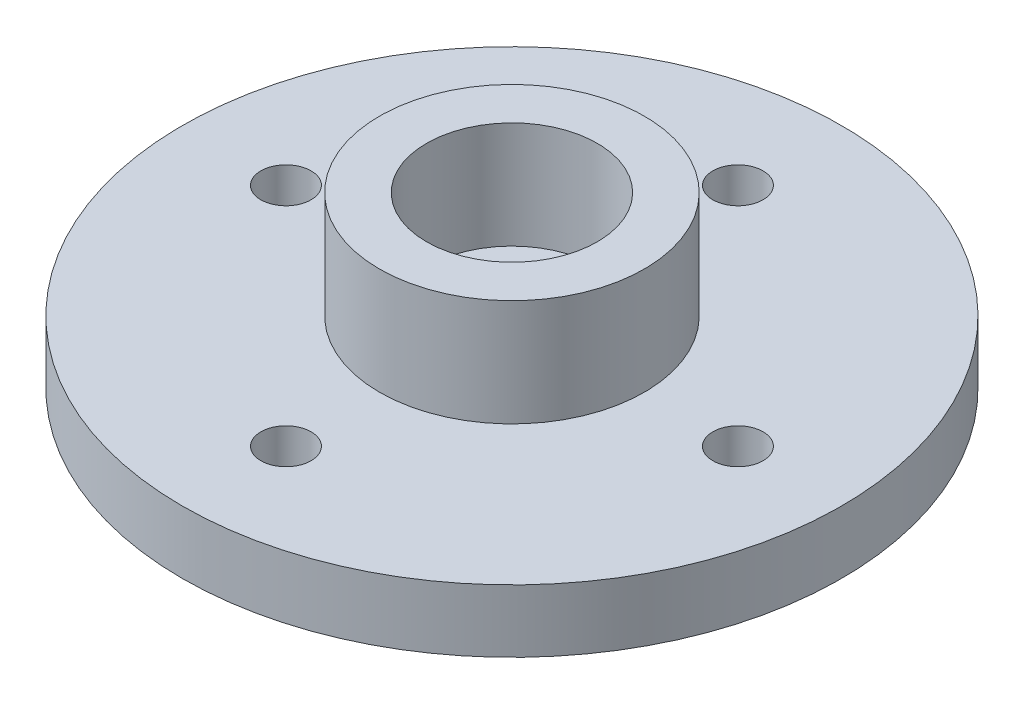
ISO-10303-21;
HEADER;
FILE_DESCRIPTION(('STEP AP214'),'2;1');
FILE_NAME('part.step','',(''),(''),'','','');
FILE_SCHEMA(('AUTOMOTIVE_DESIGN { 1 0 10303 214 1 1 1 1 }'));
ENDSEC;
DATA;
#1=APPLICATION_CONTEXT('core data for automotive mechanical design processes');
#2=APPLICATION_PROTOCOL_DEFINITION('international standard','automotive_design',2000,#1);
#3=PRODUCT_CONTEXT('',#1,'mechanical');
#4=PRODUCT('Part','Part','',(#3));
#5=PRODUCT_RELATED_PRODUCT_CATEGORY('part','',(#4));
#6=PRODUCT_DEFINITION_FORMATION('','',#4);
#7=PRODUCT_DEFINITION_CONTEXT('part definition',#1,'design');
#8=PRODUCT_DEFINITION('design','',#6,#7);
#9=PRODUCT_DEFINITION_SHAPE('','',#8);
#10=(LENGTH_UNIT() NAMED_UNIT(*) SI_UNIT(.MILLI.,.METRE.));
#11=(NAMED_UNIT(*) PLANE_ANGLE_UNIT() SI_UNIT($,.RADIAN.));
#12=(NAMED_UNIT(*) SI_UNIT($,.STERADIAN.) SOLID_ANGLE_UNIT());
#13=UNCERTAINTY_MEASURE_WITH_UNIT(LENGTH_MEASURE(1.E-05),#10,'distance_accuracy_value','');
#14=(GEOMETRIC_REPRESENTATION_CONTEXT(3) GLOBAL_UNCERTAINTY_ASSIGNED_CONTEXT((#13)) GLOBAL_UNIT_ASSIGNED_CONTEXT((#10,
#11,#12)) REPRESENTATION_CONTEXT('',''));
#15=CARTESIAN_POINT('',(0.,0.,0.));
#16=DIRECTION('',(0.,0.,1.));
#17=DIRECTION('',(1.,0.,0.));
#18=AXIS2_PLACEMENT_3D('',#15,#16,#17);
#19=CARTESIAN_POINT('',(0.,2.,0.));
#20=DIRECTION('',(0.,1.,0.));
#21=DIRECTION('',(0.,0.,1.));
#22=AXIS2_PLACEMENT_3D('',#19,#20,#21);
#23=PLANE('',#22);
#24=CARTESIAN_POINT('',(0.,2.,0.));
#25=DIRECTION('',(0.,1.,0.));
#26=DIRECTION('',(0.,0.,1.));
#27=AXIS2_PLACEMENT_3D('',#24,#25,#26);
#28=CIRCLE('',#27,1.5);
#29=CARTESIAN_POINT('',(0.,2.,1.5));
#30=VERTEX_POINT('',#29);
#31=EDGE_CURVE('E80',#30,#30,#28,.T.);
#32=ORIENTED_EDGE('',*,*,#31,.F.);
#33=EDGE_LOOP('',(#32));
#34=FACE_BOUND('',#33,.T.);
#35=CARTESIAN_POINT('',(0.,2.,0.));
#36=DIRECTION('',(0.,1.,0.));
#37=DIRECTION('',(0.,0.,1.));
#38=AXIS2_PLACEMENT_3D('',#35,#36,#37);
#39=CIRCLE('',#38,2.72);
#40=CARTESIAN_POINT('',(0.,2.,2.72));
#41=VERTEX_POINT('',#40);
#42=EDGE_CURVE('E10',#41,#41,#39,.F.);
#43=ORIENTED_EDGE('',*,*,#42,.F.);
#44=EDGE_LOOP('',(#43));
#45=FACE_BOUND('',#44,.T.);
#46=ADVANCED_FACE('F38',(#34,#45),#23,.T.);
#47=CARTESIAN_POINT('',(0.,2.,0.));
#48=DIRECTION('',(0.,1.,0.));
#49=DIRECTION('',(0.,0.,1.));
#50=AXIS2_PLACEMENT_3D('',#47,#48,#49);
#51=CIRCLE('',#50,4.22);
#52=CARTESIAN_POINT('',(0.,2.,4.22));
#53=VERTEX_POINT('',#52);
#54=EDGE_CURVE('E86',#53,#53,#51,.T.);
#55=ORIENTED_EDGE('',*,*,#54,.F.);
#56=EDGE_LOOP('',(#55));
#57=FACE_BOUND('',#56,.T.);
#58=CARTESIAN_POINT('',(4.06627378711659E-13,2.,7.2));
#59=DIRECTION('',(0.,1.,0.));
#60=DIRECTION('',(0.,0.,1.));
#61=AXIS2_PLACEMENT_3D('',#58,#59,#60);
#62=CIRCLE('',#61,0.800000000000437);
#63=CARTESIAN_POINT('',(4.06627378711659E-13,2.,8.00000000000044));
#64=VERTEX_POINT('',#63);
#65=EDGE_CURVE('E65',#64,#64,#62,.T.);
#66=ORIENTED_EDGE('',*,*,#65,.F.);
#67=EDGE_LOOP('',(#66));
#68=FACE_BOUND('',#67,.T.);
#69=CARTESIAN_POINT('',(0.,2.,-7.2));
#70=DIRECTION('',(0.,1.,0.));
#71=DIRECTION('',(0.,0.,1.));
#72=AXIS2_PLACEMENT_3D('',#69,#70,#71);
#73=CIRCLE('',#72,0.8);
#74=CARTESIAN_POINT('',(0.,2.,-6.4));
#75=VERTEX_POINT('',#74);
#76=EDGE_CURVE('E54',#75,#75,#73,.T.);
#77=ORIENTED_EDGE('',*,*,#76,.F.);
#78=EDGE_LOOP('',(#77));
#79=FACE_BOUND('',#78,.T.);
#80=CARTESIAN_POINT('',(0.,2.,0.));
#81=DIRECTION('',(0.,1.,0.));
#82=DIRECTION('',(0.,0.,1.));
#83=AXIS2_PLACEMENT_3D('',#80,#81,#82);
#84=CIRCLE('',#83,10.5);
#85=CARTESIAN_POINT('',(0.,2.,10.5));
#86=VERTEX_POINT('',#85);
#87=EDGE_CURVE('E45',#86,#86,#84,.T.);
#88=ORIENTED_EDGE('',*,*,#87,.T.);
#89=EDGE_LOOP('',(#88));
#90=FACE_BOUND('',#89,.T.);
#91=CARTESIAN_POINT('',(7.2000000000002,2.,-2.0331368935583E-13));
#92=DIRECTION('',(0.,1.,0.));
#93=DIRECTION('',(0.,0.,1.));
#94=AXIS2_PLACEMENT_3D('',#91,#92,#93);
#95=CIRCLE('',#94,0.800000000000159);
#96=CARTESIAN_POINT('',(7.2000000000002,2.,0.799999999999956));
#97=VERTEX_POINT('',#96);
#98=EDGE_CURVE('E59',#97,#97,#95,.T.);
#99=ORIENTED_EDGE('',*,*,#98,.F.);
#100=EDGE_LOOP('',(#99));
#101=FACE_BOUND('',#100,.T.);
#102=CARTESIAN_POINT('',(-7.1999999999998,2.,2.04195435051216E-13));
#103=DIRECTION('',(0.,1.,0.));
#104=DIRECTION('',(0.,0.,1.));
#105=AXIS2_PLACEMENT_3D('',#102,#103,#104);
#106=CIRCLE('',#105,0.800000000000327);
#107=CARTESIAN_POINT('',(-7.1999999999998,2.,0.800000000000531));
#108=VERTEX_POINT('',#107);
#109=EDGE_CURVE('E71',#108,#108,#106,.T.);
#110=ORIENTED_EDGE('',*,*,#109,.F.);
#111=EDGE_LOOP('',(#110));
#112=FACE_BOUND('',#111,.T.);
#113=ADVANCED_FACE('F109',(#57,#68,#79,#90,#101,#112),#23,.T.);
#114=CARTESIAN_POINT('',(0.,0.,0.));
#115=DIRECTION('',(0.,1.,0.));
#116=DIRECTION('',(0.,0.,1.));
#117=AXIS2_PLACEMENT_3D('',#114,#115,#116);
#118=PLANE('',#117);
#119=CARTESIAN_POINT('',(0.,0.,0.));
#120=DIRECTION('',(0.,1.,0.));
#121=DIRECTION('',(0.,0.,1.));
#122=AXIS2_PLACEMENT_3D('',#119,#120,#121);
#123=CIRCLE('',#122,1.5);
#124=CARTESIAN_POINT('',(0.,0.,1.5));
#125=VERTEX_POINT('',#124);
#126=EDGE_CURVE('E77',#125,#125,#123,.T.);
#127=ORIENTED_EDGE('',*,*,#126,.T.);
#128=EDGE_LOOP('',(#127));
#129=FACE_BOUND('',#128,.T.);
#130=CARTESIAN_POINT('',(0.,0.,0.));
#131=DIRECTION('',(0.,1.,0.));
#132=DIRECTION('',(0.,0.,1.));
#133=AXIS2_PLACEMENT_3D('',#130,#131,#132);
#134=CIRCLE('',#133,10.5);
#135=CARTESIAN_POINT('',(0.,0.,10.5));
#136=VERTEX_POINT('',#135);
#137=EDGE_CURVE('E49',#136,#136,#134,.T.);
#138=ORIENTED_EDGE('',*,*,#137,.F.);
#139=EDGE_LOOP('',(#138));
#140=FACE_BOUND('',#139,.T.);
#141=CARTESIAN_POINT('',(0.,0.,-7.2));
#142=DIRECTION('',(0.,1.,0.));
#143=DIRECTION('',(0.,0.,1.));
#144=AXIS2_PLACEMENT_3D('',#141,#142,#143);
#145=CIRCLE('',#144,0.8);
#146=CARTESIAN_POINT('',(0.,0.,-6.4));
#147=VERTEX_POINT('',#146);
#148=EDGE_CURVE('E56',#147,#147,#145,.T.);
#149=ORIENTED_EDGE('',*,*,#148,.T.);
#150=EDGE_LOOP('',(#149));
#151=FACE_BOUND('',#150,.T.);
#152=CARTESIAN_POINT('',(7.2000000000002,0.,-2.0331368935583E-13));
#153=DIRECTION('',(0.,1.,0.));
#154=DIRECTION('',(0.,0.,1.));
#155=AXIS2_PLACEMENT_3D('',#152,#153,#154);
#156=CIRCLE('',#155,0.800000000000159);
#157=CARTESIAN_POINT('',(7.2000000000002,0.,0.799999999999956));
#158=VERTEX_POINT('',#157);
#159=EDGE_CURVE('E62',#158,#158,#156,.T.);
#160=ORIENTED_EDGE('',*,*,#159,.T.);
#161=EDGE_LOOP('',(#160));
#162=FACE_BOUND('',#161,.T.);
#163=CARTESIAN_POINT('',(4.06627378711659E-13,0.,7.2));
#164=DIRECTION('',(0.,1.,0.));
#165=DIRECTION('',(0.,0.,1.));
#166=AXIS2_PLACEMENT_3D('',#163,#164,#165);
#167=CIRCLE('',#166,0.800000000000437);
#168=CARTESIAN_POINT('',(4.06627378711659E-13,0.,8.00000000000044));
#169=VERTEX_POINT('',#168);
#170=EDGE_CURVE('E68',#169,#169,#167,.T.);
#171=ORIENTED_EDGE('',*,*,#170,.T.);
#172=EDGE_LOOP('',(#171));
#173=FACE_BOUND('',#172,.T.);
#174=CARTESIAN_POINT('',(-7.1999999999998,0.,2.04195435051216E-13));
#175=DIRECTION('',(0.,1.,0.));
#176=DIRECTION('',(0.,0.,1.));
#177=AXIS2_PLACEMENT_3D('',#174,#175,#176);
#178=CIRCLE('',#177,0.800000000000327);
#179=CARTESIAN_POINT('',(-7.1999999999998,0.,0.800000000000531));
#180=VERTEX_POINT('',#179);
#181=EDGE_CURVE('E74',#180,#180,#178,.T.);
#182=ORIENTED_EDGE('',*,*,#181,.T.);
#183=EDGE_LOOP('',(#182));
#184=FACE_BOUND('',#183,.T.);
#185=ADVANCED_FACE('F112',(#129,#140,#151,#162,#173,#184),#118,.F.);
#186=CARTESIAN_POINT('',(0.,2.,0.));
#187=DIRECTION('',(0.,-1.,0.));
#188=DIRECTION('',(0.,0.,-1.));
#189=AXIS2_PLACEMENT_3D('',#186,#187,#188);
#190=CYLINDRICAL_SURFACE('',#189,10.5);
#191=ORIENTED_EDGE('',*,*,#87,.F.);
#192=EDGE_LOOP('',(#191));
#193=FACE_BOUND('',#192,.T.);
#194=ORIENTED_EDGE('',*,*,#137,.T.);
#195=EDGE_LOOP('',(#194));
#196=FACE_BOUND('',#195,.T.);
#197=ADVANCED_FACE('F40',(#193,#196),#190,.T.);
#198=CARTESIAN_POINT('',(0.,2.,-7.2));
#199=DIRECTION('',(0.,-1.,0.));
#200=DIRECTION('',(0.,0.,-1.));
#201=AXIS2_PLACEMENT_3D('',#198,#199,#200);
#202=CYLINDRICAL_SURFACE('',#201,0.8);
#203=ORIENTED_EDGE('',*,*,#76,.T.);
#204=EDGE_LOOP('',(#203));
#205=FACE_BOUND('',#204,.T.);
#206=ORIENTED_EDGE('',*,*,#148,.F.);
#207=EDGE_LOOP('',(#206));
#208=FACE_BOUND('',#207,.T.);
#209=ADVANCED_FACE('F135',(#205,#208),#202,.F.);
#210=CARTESIAN_POINT('',(7.2000000000002,2.,-2.0331368935583E-13));
#211=DIRECTION('',(0.,-1.,0.));
#212=DIRECTION('',(0.,0.,-1.));
#213=AXIS2_PLACEMENT_3D('',#210,#211,#212);
#214=CYLINDRICAL_SURFACE('',#213,0.800000000000159);
#215=ORIENTED_EDGE('',*,*,#98,.T.);
#216=EDGE_LOOP('',(#215));
#217=FACE_BOUND('',#216,.T.);
#218=ORIENTED_EDGE('',*,*,#159,.F.);
#219=EDGE_LOOP('',(#218));
#220=FACE_BOUND('',#219,.T.);
#221=ADVANCED_FACE('F147',(#217,#220),#214,.F.);
#222=CARTESIAN_POINT('',(4.06627378711659E-13,2.,7.2));
#223=DIRECTION('',(0.,-1.,0.));
#224=DIRECTION('',(0.,0.,-1.));
#225=AXIS2_PLACEMENT_3D('',#222,#223,#224);
#226=CYLINDRICAL_SURFACE('',#225,0.800000000000437);
#227=ORIENTED_EDGE('',*,*,#65,.T.);
#228=EDGE_LOOP('',(#227));
#229=FACE_BOUND('',#228,.T.);
#230=ORIENTED_EDGE('',*,*,#170,.F.);
#231=EDGE_LOOP('',(#230));
#232=FACE_BOUND('',#231,.T.);
#233=ADVANCED_FACE('F126',(#229,#232),#226,.F.);
#234=CARTESIAN_POINT('',(-7.1999999999998,2.,2.04195435051216E-13));
#235=DIRECTION('',(0.,-1.,0.));
#236=DIRECTION('',(0.,0.,-1.));
#237=AXIS2_PLACEMENT_3D('',#234,#235,#236);
#238=CYLINDRICAL_SURFACE('',#237,0.800000000000327);
#239=ORIENTED_EDGE('',*,*,#109,.T.);
#240=EDGE_LOOP('',(#239));
#241=FACE_BOUND('',#240,.T.);
#242=ORIENTED_EDGE('',*,*,#181,.F.);
#243=EDGE_LOOP('',(#242));
#244=FACE_BOUND('',#243,.T.);
#245=ADVANCED_FACE('F122',(#241,#244),#238,.F.);
#246=CARTESIAN_POINT('',(0.,0.,0.));
#247=DIRECTION('',(0.,1.,0.));
#248=DIRECTION('',(0.,0.,1.));
#249=AXIS2_PLACEMENT_3D('',#246,#247,#248);
#250=CYLINDRICAL_SURFACE('',#249,1.5);
#251=ORIENTED_EDGE('',*,*,#126,.F.);
#252=EDGE_LOOP('',(#251));
#253=FACE_BOUND('',#252,.T.);
#254=ORIENTED_EDGE('',*,*,#31,.T.);
#255=EDGE_LOOP('',(#254));
#256=FACE_BOUND('',#255,.T.);
#257=ADVANCED_FACE('F125',(#253,#256),#250,.F.);
#258=CARTESIAN_POINT('',(0.,5.4,0.));
#259=DIRECTION('',(0.,-1.,0.));
#260=DIRECTION('',(0.,0.,-1.));
#261=AXIS2_PLACEMENT_3D('',#258,#259,#260);
#262=CYLINDRICAL_SURFACE('',#261,2.72);
#263=CARTESIAN_POINT('',(0.,5.4,0.));
#264=DIRECTION('',(0.,1.,0.));
#265=DIRECTION('',(0.,0.,1.));
#266=AXIS2_PLACEMENT_3D('',#263,#264,#265);
#267=CIRCLE('',#266,2.72);
#268=CARTESIAN_POINT('',(0.,5.4,2.72));
#269=VERTEX_POINT('',#268);
#270=EDGE_CURVE('E89',#269,#269,#267,.T.);
#271=ORIENTED_EDGE('',*,*,#270,.T.);
#272=EDGE_LOOP('',(#271));
#273=FACE_BOUND('',#272,.T.);
#274=ORIENTED_EDGE('',*,*,#42,.T.);
#275=EDGE_LOOP('',(#274));
#276=FACE_BOUND('',#275,.T.);
#277=ADVANCED_FACE('F95',(#273,#276),#262,.F.);
#278=CARTESIAN_POINT('',(0.,5.4,0.));
#279=DIRECTION('',(0.,-1.,0.));
#280=DIRECTION('',(0.,0.,-1.));
#281=AXIS2_PLACEMENT_3D('',#278,#279,#280);
#282=CYLINDRICAL_SURFACE('',#281,4.22);
#283=CARTESIAN_POINT('',(0.,5.4,0.));
#284=DIRECTION('',(0.,1.,0.));
#285=DIRECTION('',(0.,0.,1.));
#286=AXIS2_PLACEMENT_3D('',#283,#284,#285);
#287=CIRCLE('',#286,4.22);
#288=CARTESIAN_POINT('',(0.,5.4,4.22));
#289=VERTEX_POINT('',#288);
#290=EDGE_CURVE('E83',#289,#289,#287,.T.);
#291=ORIENTED_EDGE('',*,*,#290,.F.);
#292=EDGE_LOOP('',(#291));
#293=FACE_BOUND('',#292,.T.);
#294=ORIENTED_EDGE('',*,*,#54,.T.);
#295=EDGE_LOOP('',(#294));
#296=FACE_BOUND('',#295,.T.);
#297=ADVANCED_FACE('F100',(#293,#296),#282,.T.);
#298=CARTESIAN_POINT('',(0.,5.4,0.));
#299=DIRECTION('',(0.,1.,0.));
#300=DIRECTION('',(0.,0.,1.));
#301=AXIS2_PLACEMENT_3D('',#298,#299,#300);
#302=PLANE('',#301);
#303=ORIENTED_EDGE('',*,*,#270,.F.);
#304=EDGE_LOOP('',(#303));
#305=FACE_BOUND('',#304,.T.);
#306=ORIENTED_EDGE('',*,*,#290,.T.);
#307=EDGE_LOOP('',(#306));
#308=FACE_BOUND('',#307,.T.);
#309=ADVANCED_FACE('F97',(#305,#308),#302,.T.);
#310=CLOSED_SHELL('',(#46,#113,#185,#197,#209,#221,#233,#245,#257,#277,#297,#309));
#311=MANIFOLD_SOLID_BREP('B2',#310);
#312=ADVANCED_BREP_SHAPE_REPRESENTATION('',(#18,#311),#14);
#313=SHAPE_DEFINITION_REPRESENTATION(#9,#312);
ENDSEC;
END-ISO-10303-21;
